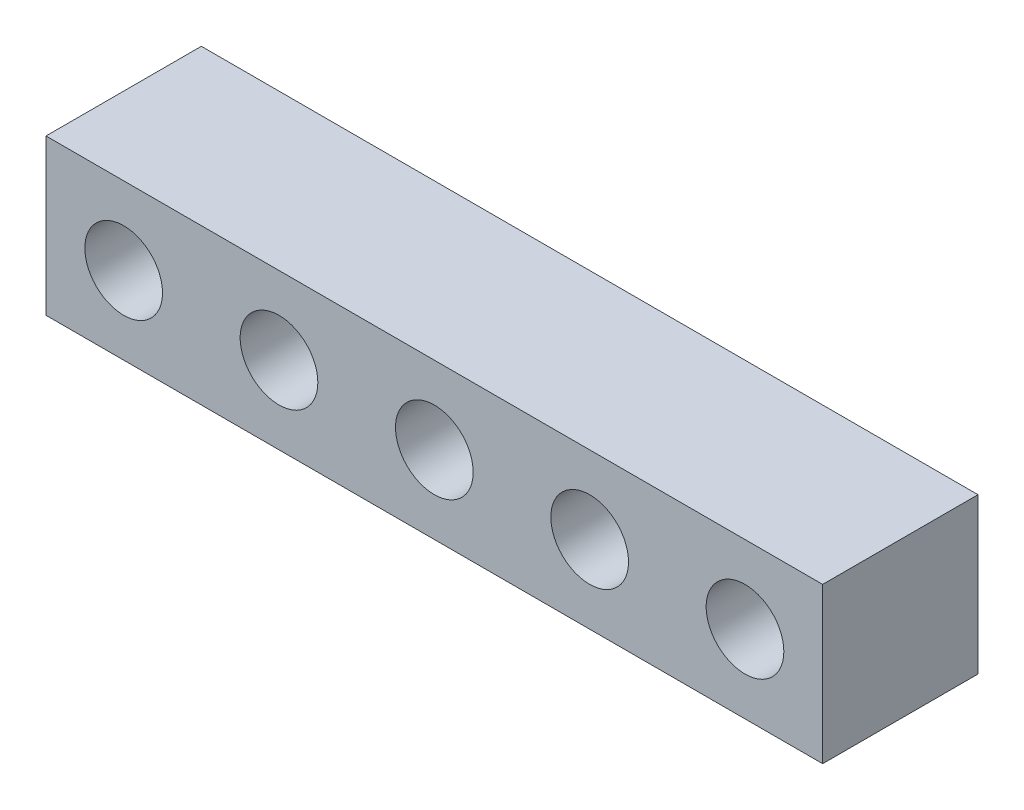
ISO-10303-21;
HEADER;
FILE_DESCRIPTION(('STEP AP214'),'2;1');
FILE_NAME('part.step','',(''),(''),'','','');
FILE_SCHEMA(('AUTOMOTIVE_DESIGN { 1 0 10303 214 1 1 1 1 }'));
ENDSEC;
DATA;
#1=APPLICATION_CONTEXT('core data for automotive mechanical design processes');
#2=APPLICATION_PROTOCOL_DEFINITION('international standard','automotive_design',2000,#1);
#3=PRODUCT_CONTEXT('',#1,'mechanical');
#4=PRODUCT('Part','Part','',(#3));
#5=PRODUCT_RELATED_PRODUCT_CATEGORY('part','',(#4));
#6=PRODUCT_DEFINITION_FORMATION('','',#4);
#7=PRODUCT_DEFINITION_CONTEXT('part definition',#1,'design');
#8=PRODUCT_DEFINITION('design','',#6,#7);
#9=PRODUCT_DEFINITION_SHAPE('','',#8);
#10=(LENGTH_UNIT() NAMED_UNIT(*) SI_UNIT(.MILLI.,.METRE.));
#11=(NAMED_UNIT(*) PLANE_ANGLE_UNIT() SI_UNIT($,.RADIAN.));
#12=(NAMED_UNIT(*) SI_UNIT($,.STERADIAN.) SOLID_ANGLE_UNIT());
#13=UNCERTAINTY_MEASURE_WITH_UNIT(LENGTH_MEASURE(1.E-05),#10,'distance_accuracy_value','');
#14=(GEOMETRIC_REPRESENTATION_CONTEXT(3) GLOBAL_UNCERTAINTY_ASSIGNED_CONTEXT((#13)) GLOBAL_UNIT_ASSIGNED_CONTEXT((#10,
#11,#12)) REPRESENTATION_CONTEXT('',''));
#15=CARTESIAN_POINT('',(0.,0.,0.));
#16=DIRECTION('',(0.,0.,1.));
#17=DIRECTION('',(1.,0.,0.));
#18=AXIS2_PLACEMENT_3D('',#15,#16,#17);
#19=CARTESIAN_POINT('',(0.,0.,10.));
#20=DIRECTION('',(1.,0.,0.));
#21=DIRECTION('',(0.,0.,-1.));
#22=AXIS2_PLACEMENT_3D('',#19,#20,#21);
#23=PLANE('',#22);
#24=DIRECTION('',(0.,-1.,0.));
#25=VECTOR('',#24,1.);
#26=CARTESIAN_POINT('',(0.,0.,0.));
#27=LINE('',#26,#25);
#28=CARTESIAN_POINT('',(0.,10.,0.));
#29=VERTEX_POINT('',#28);
#30=CARTESIAN_POINT('',(0.,0.,0.));
#31=VERTEX_POINT('',#30);
#32=EDGE_CURVE('E109',#29,#31,#27,.T.);
#33=ORIENTED_EDGE('',*,*,#32,.T.);
#34=DIRECTION('',(0.,0.,-1.));
#35=VECTOR('',#34,1.);
#36=CARTESIAN_POINT('',(0.,0.,10.));
#37=LINE('',#36,#35);
#38=CARTESIAN_POINT('',(0.,0.,10.));
#39=VERTEX_POINT('',#38);
#40=EDGE_CURVE('E11',#39,#31,#37,.T.);
#41=ORIENTED_EDGE('',*,*,#40,.F.);
#42=DIRECTION('',(0.,-1.,0.));
#43=VECTOR('',#42,1.);
#44=CARTESIAN_POINT('',(0.,0.,10.));
#45=LINE('',#44,#43);
#46=CARTESIAN_POINT('',(0.,10.,10.));
#47=VERTEX_POINT('',#46);
#48=EDGE_CURVE('E93',#47,#39,#45,.T.);
#49=ORIENTED_EDGE('',*,*,#48,.F.);
#50=DIRECTION('',(0.,0.,-1.));
#51=VECTOR('',#50,1.);
#52=CARTESIAN_POINT('',(0.,10.,10.));
#53=LINE('',#52,#51);
#54=EDGE_CURVE('E105',#47,#29,#53,.T.);
#55=ORIENTED_EDGE('',*,*,#54,.T.);
#56=EDGE_LOOP('',(#33,#41,#49,#55));
#57=FACE_BOUND('',#56,.T.);
#58=ADVANCED_FACE('F41',(#57),#23,.F.);
#59=CARTESIAN_POINT('',(0.,0.,10.));
#60=DIRECTION('',(0.,1.,0.));
#61=DIRECTION('',(0.,0.,1.));
#62=AXIS2_PLACEMENT_3D('',#59,#60,#61);
#63=PLANE('',#62);
#64=DIRECTION('',(1.,0.,0.));
#65=VECTOR('',#64,1.);
#66=CARTESIAN_POINT('',(0.,0.,0.));
#67=LINE('',#66,#65);
#68=CARTESIAN_POINT('',(50.,0.,0.));
#69=VERTEX_POINT('',#68);
#70=EDGE_CURVE('E98',#31,#69,#67,.T.);
#71=ORIENTED_EDGE('',*,*,#70,.T.);
#72=DIRECTION('',(0.,0.,-1.));
#73=VECTOR('',#72,1.);
#74=CARTESIAN_POINT('',(50.,0.,10.));
#75=LINE('',#74,#73);
#76=CARTESIAN_POINT('',(50.,0.,10.));
#77=VERTEX_POINT('',#76);
#78=EDGE_CURVE('E50',#77,#69,#75,.T.);
#79=ORIENTED_EDGE('',*,*,#78,.F.);
#80=DIRECTION('',(1.,0.,0.));
#81=VECTOR('',#80,1.);
#82=CARTESIAN_POINT('',(0.,0.,10.));
#83=LINE('',#82,#81);
#84=EDGE_CURVE('E88',#39,#77,#83,.T.);
#85=ORIENTED_EDGE('',*,*,#84,.F.);
#86=ORIENTED_EDGE('',*,*,#40,.T.);
#87=EDGE_LOOP('',(#71,#79,#85,#86));
#88=FACE_BOUND('',#87,.T.);
#89=ADVANCED_FACE('F97',(#88),#63,.F.);
#90=CARTESIAN_POINT('',(50.,0.,10.));
#91=DIRECTION('',(-1.,0.,0.));
#92=DIRECTION('',(0.,0.,1.));
#93=AXIS2_PLACEMENT_3D('',#90,#91,#92);
#94=PLANE('',#93);
#95=DIRECTION('',(0.,1.,0.));
#96=VECTOR('',#95,1.);
#97=CARTESIAN_POINT('',(50.,0.,0.));
#98=LINE('',#97,#96);
#99=CARTESIAN_POINT('',(50.,10.,0.));
#100=VERTEX_POINT('',#99);
#101=EDGE_CURVE('E75',#69,#100,#98,.T.);
#102=ORIENTED_EDGE('',*,*,#101,.T.);
#103=DIRECTION('',(0.,0.,-1.));
#104=VECTOR('',#103,1.);
#105=CARTESIAN_POINT('',(50.,10.,10.));
#106=LINE('',#105,#104);
#107=CARTESIAN_POINT('',(50.,10.,10.));
#108=VERTEX_POINT('',#107);
#109=EDGE_CURVE('E100',#108,#100,#106,.T.);
#110=ORIENTED_EDGE('',*,*,#109,.F.);
#111=DIRECTION('',(0.,1.,0.));
#112=VECTOR('',#111,1.);
#113=CARTESIAN_POINT('',(50.,0.,10.));
#114=LINE('',#113,#112);
#115=EDGE_CURVE('E91',#77,#108,#114,.T.);
#116=ORIENTED_EDGE('',*,*,#115,.F.);
#117=ORIENTED_EDGE('',*,*,#78,.T.);
#118=EDGE_LOOP('',(#102,#110,#116,#117));
#119=FACE_BOUND('',#118,.T.);
#120=ADVANCED_FACE('F101',(#119),#94,.F.);
#121=CARTESIAN_POINT('',(0.,10.,10.));
#122=DIRECTION('',(0.,-1.,0.));
#123=DIRECTION('',(0.,0.,-1.));
#124=AXIS2_PLACEMENT_3D('',#121,#122,#123);
#125=PLANE('',#124);
#126=DIRECTION('',(-1.,0.,0.));
#127=VECTOR('',#126,1.);
#128=CARTESIAN_POINT('',(0.,10.,0.));
#129=LINE('',#128,#127);
#130=EDGE_CURVE('E81',#100,#29,#129,.T.);
#131=ORIENTED_EDGE('',*,*,#130,.T.);
#132=ORIENTED_EDGE('',*,*,#54,.F.);
#133=DIRECTION('',(-1.,0.,0.));
#134=VECTOR('',#133,1.);
#135=CARTESIAN_POINT('',(0.,10.,10.));
#136=LINE('',#135,#134);
#137=EDGE_CURVE('E58',#108,#47,#136,.T.);
#138=ORIENTED_EDGE('',*,*,#137,.F.);
#139=ORIENTED_EDGE('',*,*,#109,.T.);
#140=EDGE_LOOP('',(#131,#132,#138,#139));
#141=FACE_BOUND('',#140,.T.);
#142=ADVANCED_FACE('F123',(#141),#125,.F.);
#143=CARTESIAN_POINT('',(0.,0.,10.));
#144=DIRECTION('',(0.,0.,-1.));
#145=DIRECTION('',(-1.,0.,0.));
#146=AXIS2_PLACEMENT_3D('',#143,#144,#145);
#147=PLANE('',#146);
#148=CARTESIAN_POINT('',(5.,5.,10.));
#149=DIRECTION('',(0.,0.,1.));
#150=DIRECTION('',(1.,0.,0.));
#151=AXIS2_PLACEMENT_3D('',#148,#149,#150);
#152=CIRCLE('',#151,2.5);
#153=CARTESIAN_POINT('',(7.5,5.,10.));
#154=VERTEX_POINT('',#153);
#155=EDGE_CURVE('E113',#154,#154,#152,.T.);
#156=ORIENTED_EDGE('',*,*,#155,.F.);
#157=EDGE_LOOP('',(#156));
#158=FACE_BOUND('',#157,.T.);
#159=CARTESIAN_POINT('',(15.,5.,10.));
#160=DIRECTION('',(0.,0.,1.));
#161=DIRECTION('',(1.,0.,0.));
#162=AXIS2_PLACEMENT_3D('',#159,#160,#161);
#163=CIRCLE('',#162,2.5);
#164=CARTESIAN_POINT('',(17.5,5.,10.));
#165=VERTEX_POINT('',#164);
#166=EDGE_CURVE('E158',#165,#165,#163,.T.);
#167=ORIENTED_EDGE('',*,*,#166,.F.);
#168=EDGE_LOOP('',(#167));
#169=FACE_BOUND('',#168,.T.);
#170=CARTESIAN_POINT('',(25.,5.,10.));
#171=DIRECTION('',(0.,0.,1.));
#172=DIRECTION('',(1.,0.,0.));
#173=AXIS2_PLACEMENT_3D('',#170,#171,#172);
#174=CIRCLE('',#173,2.5);
#175=CARTESIAN_POINT('',(27.5,5.,10.));
#176=VERTEX_POINT('',#175);
#177=EDGE_CURVE('E150',#176,#176,#174,.T.);
#178=ORIENTED_EDGE('',*,*,#177,.F.);
#179=EDGE_LOOP('',(#178));
#180=FACE_BOUND('',#179,.T.);
#181=CARTESIAN_POINT('',(35.,5.,10.));
#182=DIRECTION('',(0.,0.,1.));
#183=DIRECTION('',(1.,0.,0.));
#184=AXIS2_PLACEMENT_3D('',#181,#182,#183);
#185=CIRCLE('',#184,2.5);
#186=CARTESIAN_POINT('',(37.5,5.,10.));
#187=VERTEX_POINT('',#186);
#188=EDGE_CURVE('E142',#187,#187,#185,.T.);
#189=ORIENTED_EDGE('',*,*,#188,.F.);
#190=EDGE_LOOP('',(#189));
#191=FACE_BOUND('',#190,.T.);
#192=CARTESIAN_POINT('',(45.,5.,10.));
#193=DIRECTION('',(0.,0.,1.));
#194=DIRECTION('',(1.,0.,0.));
#195=AXIS2_PLACEMENT_3D('',#192,#193,#194);
#196=CIRCLE('',#195,2.5);
#197=CARTESIAN_POINT('',(47.5,5.,10.));
#198=VERTEX_POINT('',#197);
#199=EDGE_CURVE('E134',#198,#198,#196,.T.);
#200=ORIENTED_EDGE('',*,*,#199,.F.);
#201=EDGE_LOOP('',(#200));
#202=FACE_BOUND('',#201,.T.);
#203=ORIENTED_EDGE('',*,*,#48,.T.);
#204=ORIENTED_EDGE('',*,*,#84,.T.);
#205=ORIENTED_EDGE('',*,*,#115,.T.);
#206=ORIENTED_EDGE('',*,*,#137,.T.);
#207=EDGE_LOOP('',(#203,#204,#205,#206));
#208=FACE_BOUND('',#207,.T.);
#209=ADVANCED_FACE('F89',(#158,#169,#180,#191,#202,#208),#147,.F.);
#210=CARTESIAN_POINT('',(0.,0.,0.));
#211=DIRECTION('',(0.,0.,-1.));
#212=DIRECTION('',(-1.,0.,0.));
#213=AXIS2_PLACEMENT_3D('',#210,#211,#212);
#214=PLANE('',#213);
#215=CARTESIAN_POINT('',(5.,5.,0.));
#216=DIRECTION('',(0.,0.,-1.));
#217=DIRECTION('',(-1.,0.,0.));
#218=AXIS2_PLACEMENT_3D('',#215,#216,#217);
#219=CIRCLE('',#218,2.5);
#220=CARTESIAN_POINT('',(2.5,5.,0.));
#221=VERTEX_POINT('',#220);
#222=EDGE_CURVE('E162',#221,#221,#219,.F.);
#223=ORIENTED_EDGE('',*,*,#222,.T.);
#224=EDGE_LOOP('',(#223));
#225=FACE_BOUND('',#224,.T.);
#226=CARTESIAN_POINT('',(15.,5.,0.));
#227=DIRECTION('',(0.,0.,-1.));
#228=DIRECTION('',(-1.,0.,0.));
#229=AXIS2_PLACEMENT_3D('',#226,#227,#228);
#230=CIRCLE('',#229,2.5);
#231=CARTESIAN_POINT('',(12.5,5.,0.));
#232=VERTEX_POINT('',#231);
#233=EDGE_CURVE('E154',#232,#232,#230,.F.);
#234=ORIENTED_EDGE('',*,*,#233,.T.);
#235=EDGE_LOOP('',(#234));
#236=FACE_BOUND('',#235,.T.);
#237=CARTESIAN_POINT('',(25.,5.,0.));
#238=DIRECTION('',(0.,0.,-1.));
#239=DIRECTION('',(-1.,0.,0.));
#240=AXIS2_PLACEMENT_3D('',#237,#238,#239);
#241=CIRCLE('',#240,2.5);
#242=CARTESIAN_POINT('',(22.5,5.,0.));
#243=VERTEX_POINT('',#242);
#244=EDGE_CURVE('E146',#243,#243,#241,.F.);
#245=ORIENTED_EDGE('',*,*,#244,.T.);
#246=EDGE_LOOP('',(#245));
#247=FACE_BOUND('',#246,.T.);
#248=CARTESIAN_POINT('',(35.,5.,0.));
#249=DIRECTION('',(0.,0.,-1.));
#250=DIRECTION('',(-1.,0.,0.));
#251=AXIS2_PLACEMENT_3D('',#248,#249,#250);
#252=CIRCLE('',#251,2.5);
#253=CARTESIAN_POINT('',(32.5,5.,0.));
#254=VERTEX_POINT('',#253);
#255=EDGE_CURVE('E138',#254,#254,#252,.F.);
#256=ORIENTED_EDGE('',*,*,#255,.T.);
#257=EDGE_LOOP('',(#256));
#258=FACE_BOUND('',#257,.T.);
#259=CARTESIAN_POINT('',(45.,5.,0.));
#260=DIRECTION('',(0.,0.,-1.));
#261=DIRECTION('',(-1.,0.,0.));
#262=AXIS2_PLACEMENT_3D('',#259,#260,#261);
#263=CIRCLE('',#262,2.5);
#264=CARTESIAN_POINT('',(42.5,5.,0.));
#265=VERTEX_POINT('',#264);
#266=EDGE_CURVE('E130',#265,#265,#263,.F.);
#267=ORIENTED_EDGE('',*,*,#266,.T.);
#268=EDGE_LOOP('',(#267));
#269=FACE_BOUND('',#268,.T.);
#270=ORIENTED_EDGE('',*,*,#32,.F.);
#271=ORIENTED_EDGE('',*,*,#130,.F.);
#272=ORIENTED_EDGE('',*,*,#101,.F.);
#273=ORIENTED_EDGE('',*,*,#70,.F.);
#274=EDGE_LOOP('',(#270,#271,#272,#273));
#275=FACE_BOUND('',#274,.T.);
#276=ADVANCED_FACE('F126',(#225,#236,#247,#258,#269,#275),#214,.T.);
#277=CARTESIAN_POINT('',(45.,5.,-0.000999999999999265));
#278=DIRECTION('',(0.,0.,1.));
#279=DIRECTION('',(1.,0.,0.));
#280=AXIS2_PLACEMENT_3D('',#277,#278,#279);
#281=CYLINDRICAL_SURFACE('',#280,2.5);
#282=ORIENTED_EDGE('',*,*,#266,.F.);
#283=EDGE_LOOP('',(#282));
#284=FACE_BOUND('',#283,.T.);
#285=ORIENTED_EDGE('',*,*,#199,.T.);
#286=EDGE_LOOP('',(#285));
#287=FACE_BOUND('',#286,.T.);
#288=ADVANCED_FACE('F183',(#284,#287),#281,.F.);
#289=CARTESIAN_POINT('',(35.,5.,-0.000999999999999265));
#290=DIRECTION('',(0.,0.,1.));
#291=DIRECTION('',(1.,0.,0.));
#292=AXIS2_PLACEMENT_3D('',#289,#290,#291);
#293=CYLINDRICAL_SURFACE('',#292,2.5);
#294=ORIENTED_EDGE('',*,*,#255,.F.);
#295=EDGE_LOOP('',(#294));
#296=FACE_BOUND('',#295,.T.);
#297=ORIENTED_EDGE('',*,*,#188,.T.);
#298=EDGE_LOOP('',(#297));
#299=FACE_BOUND('',#298,.T.);
#300=ADVANCED_FACE('F185',(#296,#299),#293,.F.);
#301=CARTESIAN_POINT('',(25.,5.,-0.000999999999999265));
#302=DIRECTION('',(0.,0.,1.));
#303=DIRECTION('',(1.,0.,0.));
#304=AXIS2_PLACEMENT_3D('',#301,#302,#303);
#305=CYLINDRICAL_SURFACE('',#304,2.5);
#306=ORIENTED_EDGE('',*,*,#244,.F.);
#307=EDGE_LOOP('',(#306));
#308=FACE_BOUND('',#307,.T.);
#309=ORIENTED_EDGE('',*,*,#177,.T.);
#310=EDGE_LOOP('',(#309));
#311=FACE_BOUND('',#310,.T.);
#312=ADVANCED_FACE('F192',(#308,#311),#305,.F.);
#313=CARTESIAN_POINT('',(15.,5.,-0.000999999999999265));
#314=DIRECTION('',(0.,0.,1.));
#315=DIRECTION('',(1.,0.,0.));
#316=AXIS2_PLACEMENT_3D('',#313,#314,#315);
#317=CYLINDRICAL_SURFACE('',#316,2.5);
#318=ORIENTED_EDGE('',*,*,#233,.F.);
#319=EDGE_LOOP('',(#318));
#320=FACE_BOUND('',#319,.T.);
#321=ORIENTED_EDGE('',*,*,#166,.T.);
#322=EDGE_LOOP('',(#321));
#323=FACE_BOUND('',#322,.T.);
#324=ADVANCED_FACE('F239',(#320,#323),#317,.F.);
#325=CARTESIAN_POINT('',(5.,5.,-0.000999999999999265));
#326=DIRECTION('',(0.,0.,1.));
#327=DIRECTION('',(1.,0.,0.));
#328=AXIS2_PLACEMENT_3D('',#325,#326,#327);
#329=CYLINDRICAL_SURFACE('',#328,2.5);
#330=ORIENTED_EDGE('',*,*,#222,.F.);
#331=EDGE_LOOP('',(#330));
#332=FACE_BOUND('',#331,.T.);
#333=ORIENTED_EDGE('',*,*,#155,.T.);
#334=EDGE_LOOP('',(#333));
#335=FACE_BOUND('',#334,.T.);
#336=ADVANCED_FACE('F170',(#332,#335),#329,.F.);
#337=CLOSED_SHELL('',(#58,#89,#120,#142,#209,#276,#288,#300,#312,#324,#336));
#338=MANIFOLD_SOLID_BREP('B2',#337);
#339=ADVANCED_BREP_SHAPE_REPRESENTATION('',(#18,#338),#14);
#340=SHAPE_DEFINITION_REPRESENTATION(#9,#339);
ENDSEC;
END-ISO-10303-21;
